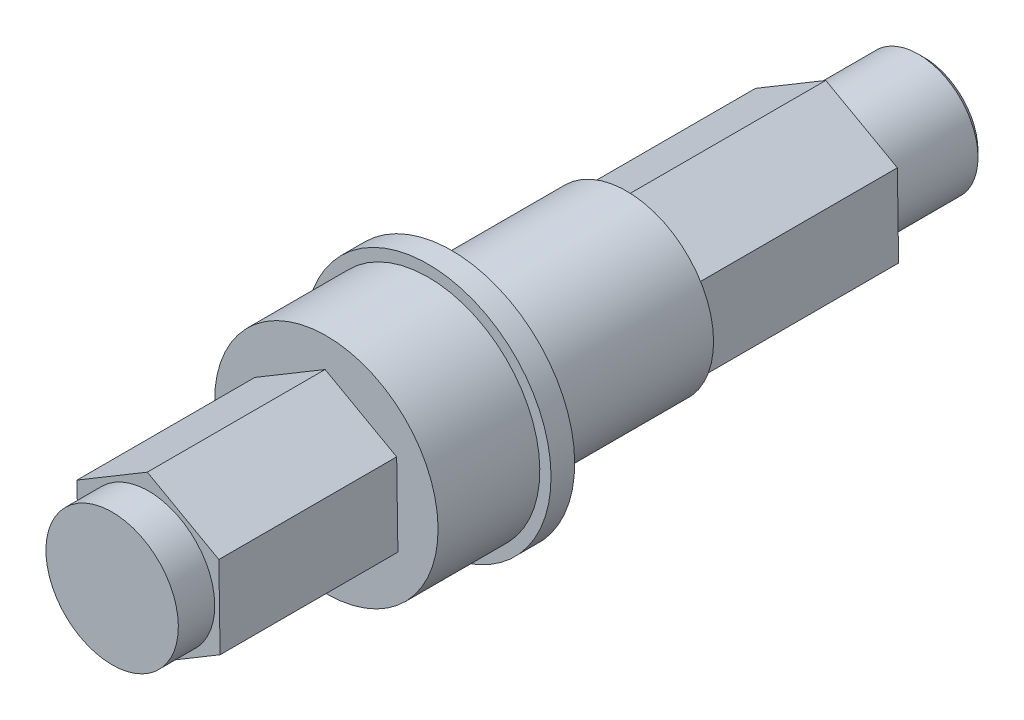
ISO-10303-21;
HEADER;
FILE_DESCRIPTION(('STEP AP214'),'2;1');
FILE_NAME('part.step','',(''),(''),'','','');
FILE_SCHEMA(('AUTOMOTIVE_DESIGN { 1 0 10303 214 1 1 1 1 }'));
ENDSEC;
DATA;
#1=APPLICATION_CONTEXT('core data for automotive mechanical design processes');
#2=APPLICATION_PROTOCOL_DEFINITION('international standard','automotive_design',2000,#1);
#3=PRODUCT_CONTEXT('',#1,'mechanical');
#4=PRODUCT('Part','Part','',(#3));
#5=PRODUCT_RELATED_PRODUCT_CATEGORY('part','',(#4));
#6=PRODUCT_DEFINITION_FORMATION('','',#4);
#7=PRODUCT_DEFINITION_CONTEXT('part definition',#1,'design');
#8=PRODUCT_DEFINITION('design','',#6,#7);
#9=PRODUCT_DEFINITION_SHAPE('','',#8);
#10=(LENGTH_UNIT() NAMED_UNIT(*) SI_UNIT(.MILLI.,.METRE.));
#11=(NAMED_UNIT(*) PLANE_ANGLE_UNIT() SI_UNIT($,.RADIAN.));
#12=(NAMED_UNIT(*) SI_UNIT($,.STERADIAN.) SOLID_ANGLE_UNIT());
#13=UNCERTAINTY_MEASURE_WITH_UNIT(LENGTH_MEASURE(1.E-05),#10,'distance_accuracy_value','');
#14=(GEOMETRIC_REPRESENTATION_CONTEXT(3) GLOBAL_UNCERTAINTY_ASSIGNED_CONTEXT((#13)) GLOBAL_UNIT_ASSIGNED_CONTEXT((#10,
#11,#12)) REPRESENTATION_CONTEXT('',''));
#15=CARTESIAN_POINT('',(0.,0.,0.));
#16=DIRECTION('',(0.,0.,1.));
#17=DIRECTION('',(1.,0.,0.));
#18=AXIS2_PLACEMENT_3D('',#15,#16,#17);
#19=CARTESIAN_POINT('',(19.8104450030768,-19.8104450030789,2.15501016800019));
#20=DIRECTION('',(0.,0.,1.));
#21=DIRECTION('',(0.999886454252792,0.0150691274392579,0.));
#22=AXIS2_PLACEMENT_3D('',#19,#20,#21);
#23=PLANE('',#22);
#24=CARTESIAN_POINT('',(19.8104450030768,-19.8104450030789,2.15501016800019));
#25=DIRECTION('',(0.,0.,1.));
#26=DIRECTION('',(0.999886454252792,0.0150691274392579,0.));
#27=AXIS2_PLACEMENT_3D('',#24,#25,#26);
#28=CIRCLE('',#27,8.255);
#29=CARTESIAN_POINT('',(28.0645076829336,-19.6860493560678,2.15501016800019));
#30=VERTEX_POINT('',#29);
#31=EDGE_CURVE('E267',#30,#30,#28,.T.);
#32=ORIENTED_EDGE('',*,*,#31,.F.);
#33=EDGE_LOOP('',(#32));
#34=FACE_BOUND('',#33,.T.);
#35=CARTESIAN_POINT('',(19.8104450030768,-19.8104450030789,2.15501016800019));
#36=DIRECTION('',(0.,0.,-1.));
#37=DIRECTION('',(0.999886454252792,0.0150691274392579,0.));
#38=AXIS2_PLACEMENT_3D('',#35,#36,#37);
#39=CIRCLE('',#38,5.842);
#40=CARTESIAN_POINT('',(25.6517816688216,-19.7224111605787,2.15501016800019));
#41=VERTEX_POINT('',#40);
#42=EDGE_CURVE('E263',#41,#41,#39,.T.);
#43=ORIENTED_EDGE('',*,*,#42,.F.);
#44=EDGE_LOOP('',(#43));
#45=FACE_BOUND('',#44,.T.);
#46=ADVANCED_FACE('F17',(#34,#45),#23,.F.);
#47=CARTESIAN_POINT('',(19.8104450030768,-19.8104450030789,-9.58150001399979));
#48=DIRECTION('',(0.,0.,1.));
#49=DIRECTION('',(0.999886454252792,0.0150691274392579,0.));
#50=AXIS2_PLACEMENT_3D('',#47,#48,#49);
#51=PLANE('',#50);
#52=CARTESIAN_POINT('',(19.8104450030768,-19.8104450030789,-9.58150001399979));
#53=DIRECTION('',(0.,0.,1.));
#54=DIRECTION('',(0.999886454252792,0.0150691274392579,0.));
#55=AXIS2_PLACEMENT_3D('',#52,#53,#54);
#56=CIRCLE('',#55,5.842);
#57=CARTESIAN_POINT('',(25.6517816688216,-19.7224111605787,-9.58150001399979));
#58=VERTEX_POINT('',#57);
#59=EDGE_CURVE('E259',#58,#58,#56,.T.);
#60=ORIENTED_EDGE('',*,*,#59,.F.);
#61=EDGE_LOOP('',(#60));
#62=FACE_BOUND('',#61,.T.);
#63=DIRECTION('',(-0.0150691274392579,0.999886454252792,0.));
#64=VECTOR('',#63,1.);
#65=CARTESIAN_POINT('',(24.6138387762371,-22.4879967317975,-9.58150001399979));
#66=LINE('',#65,#64);
#67=CARTESIAN_POINT('',(24.6138387762371,-22.4879967317975,-9.58150001399979));
#68=VERTEX_POINT('',#67);
#69=CARTESIAN_POINT('',(24.5309697066742,-16.9893598355013,-9.58150001399979));
#70=VERTEX_POINT('',#69);
#71=EDGE_CURVE('E126',#68,#70,#66,.T.);
#72=ORIENTED_EDGE('',*,*,#71,.T.);
#73=DIRECTION('',(-0.873461634002494,0.486892979951133,0.));
#74=VECTOR('',#73,1.);
#75=CARTESIAN_POINT('',(24.5309697066742,-16.9893598355013,-9.58150001399979));
#76=LINE('',#75,#74);
#77=CARTESIAN_POINT('',(19.7275759335139,-14.3118081067827,-9.58150001399979));
#78=VERTEX_POINT('',#77);
#79=EDGE_CURVE('E137',#70,#78,#76,.T.);
#80=ORIENTED_EDGE('',*,*,#79,.T.);
#81=DIRECTION('',(-0.858392506563236,-0.512993474301658,0.));
#82=VECTOR('',#81,1.);
#83=CARTESIAN_POINT('',(19.7275759335139,-14.3118081067827,-9.58150001399979));
#84=LINE('',#83,#82);
#85=CARTESIAN_POINT('',(15.0070512299164,-17.1328932743602,-9.58150001399979));
#86=VERTEX_POINT('',#85);
#87=EDGE_CURVE('E238',#78,#86,#84,.T.);
#88=ORIENTED_EDGE('',*,*,#87,.T.);
#89=DIRECTION('',(0.015069127439258,-0.999886454252792,0.));
#90=VECTOR('',#89,1.);
#91=CARTESIAN_POINT('',(15.0070512299164,-17.1328932743602,-9.58150001399979));
#92=LINE('',#91,#90);
#93=CARTESIAN_POINT('',(15.0899202994793,-22.6315301706565,-9.58150001399979));
#94=VERTEX_POINT('',#93);
#95=EDGE_CURVE('E244',#86,#94,#92,.T.);
#96=ORIENTED_EDGE('',*,*,#95,.T.);
#97=DIRECTION('',(0.873461634002494,-0.486892979951133,0.));
#98=VECTOR('',#97,1.);
#99=CARTESIAN_POINT('',(15.0899202994793,-22.6315301706565,-9.58150001399979));
#100=LINE('',#99,#98);
#101=CARTESIAN_POINT('',(19.8933140726397,-25.3090818993751,-9.58150001399979));
#102=VERTEX_POINT('',#101);
#103=EDGE_CURVE('E198',#94,#102,#100,.T.);
#104=ORIENTED_EDGE('',*,*,#103,.T.);
#105=DIRECTION('',(0.858392506563236,0.512993474301658,0.));
#106=VECTOR('',#105,1.);
#107=CARTESIAN_POINT('',(19.8933140726397,-25.3090818993751,-9.58150001399979));
#108=LINE('',#107,#106);
#109=EDGE_CURVE('E193',#102,#68,#108,.T.);
#110=ORIENTED_EDGE('',*,*,#109,.T.);
#111=EDGE_LOOP('',(#72,#80,#88,#96,#104,#110));
#112=FACE_BOUND('',#111,.T.);
#113=ADVANCED_FACE('F355',(#62,#112),#51,.F.);
#114=CARTESIAN_POINT('',(24.6138387762371,-22.4879967317975,22.63775));
#115=DIRECTION('',(-0.999886454252792,-0.0150691274392579,0.));
#116=DIRECTION('',(0.0150691274392579,-0.999886454252792,0.));
#117=AXIS2_PLACEMENT_3D('',#114,#115,#116);
#118=PLANE('',#117);
#119=DIRECTION('',(0.0150691274392579,-0.999886454252792,0.));
#120=VECTOR('',#119,1.);
#121=CARTESIAN_POINT('',(24.6138387762371,-22.4879967317975,-23.0435000139998));
#122=LINE('',#121,#120);
#123=CARTESIAN_POINT('',(24.5309697066742,-16.9893598355013,-23.0435000139998));
#124=VERTEX_POINT('',#123);
#125=CARTESIAN_POINT('',(24.6138387762371,-22.4879967317975,-23.0435000139998));
#126=VERTEX_POINT('',#125);
#127=EDGE_CURVE('E210',#124,#126,#122,.T.);
#128=ORIENTED_EDGE('',*,*,#127,.F.);
#129=DIRECTION('',(0.,0.,1.));
#130=VECTOR('',#129,1.);
#131=CARTESIAN_POINT('',(24.5309697066742,-16.9893598355013,22.63775));
#132=LINE('',#131,#130);
#133=EDGE_CURVE('E169',#70,#124,#132,.F.);
#134=ORIENTED_EDGE('',*,*,#133,.F.);
#135=ORIENTED_EDGE('',*,*,#71,.F.);
#136=DIRECTION('',(0.,0.,1.));
#137=VECTOR('',#136,1.);
#138=CARTESIAN_POINT('',(24.6138387762371,-22.4879967317975,22.63775));
#139=LINE('',#138,#137);
#140=EDGE_CURVE('E175',#68,#126,#139,.F.);
#141=ORIENTED_EDGE('',*,*,#140,.T.);
#142=EDGE_LOOP('',(#128,#134,#135,#141));
#143=FACE_BOUND('',#142,.T.);
#144=ADVANCED_FACE('F359',(#143),#118,.F.);
#145=CARTESIAN_POINT('',(24.5309697066742,-16.9893598355013,22.63775));
#146=DIRECTION('',(-0.486892979951133,-0.873461634002494,0.));
#147=DIRECTION('',(0.873461634002494,-0.486892979951133,0.));
#148=AXIS2_PLACEMENT_3D('',#145,#146,#147);
#149=PLANE('',#148);
#150=ORIENTED_EDGE('',*,*,#79,.F.);
#151=ORIENTED_EDGE('',*,*,#133,.T.);
#152=DIRECTION('',(0.873461634002494,-0.486892979951133,0.));
#153=VECTOR('',#152,1.);
#154=CARTESIAN_POINT('',(24.5309697066742,-16.9893598355013,-23.0435000139998));
#155=LINE('',#154,#153);
#156=CARTESIAN_POINT('',(19.7275759335139,-14.3118081067827,-23.0435000139998));
#157=VERTEX_POINT('',#156);
#158=EDGE_CURVE('E223',#157,#124,#155,.T.);
#159=ORIENTED_EDGE('',*,*,#158,.F.);
#160=DIRECTION('',(0.,0.,1.));
#161=VECTOR('',#160,1.);
#162=CARTESIAN_POINT('',(19.7275759335139,-14.3118081067827,22.63775));
#163=LINE('',#162,#161);
#164=EDGE_CURVE('E163',#78,#157,#163,.F.);
#165=ORIENTED_EDGE('',*,*,#164,.F.);
#166=EDGE_LOOP('',(#150,#151,#159,#165));
#167=FACE_BOUND('',#166,.T.);
#168=ADVANCED_FACE('F366',(#167),#149,.F.);
#169=CARTESIAN_POINT('',(19.7275759335139,-14.3118081067827,22.63775));
#170=DIRECTION('',(0.512993474301658,-0.858392506563236,0.));
#171=DIRECTION('',(0.858392506563236,0.512993474301658,0.));
#172=AXIS2_PLACEMENT_3D('',#169,#170,#171);
#173=PLANE('',#172);
#174=ORIENTED_EDGE('',*,*,#87,.F.);
#175=ORIENTED_EDGE('',*,*,#164,.T.);
#176=DIRECTION('',(0.858392506563236,0.512993474301658,0.));
#177=VECTOR('',#176,1.);
#178=CARTESIAN_POINT('',(19.7275759335139,-14.3118081067827,-23.0435000139998));
#179=LINE('',#178,#177);
#180=CARTESIAN_POINT('',(15.0070512299164,-17.1328932743602,-23.0435000139998));
#181=VERTEX_POINT('',#180);
#182=EDGE_CURVE('E207',#181,#157,#179,.T.);
#183=ORIENTED_EDGE('',*,*,#182,.F.);
#184=DIRECTION('',(0.,0.,1.));
#185=VECTOR('',#184,1.);
#186=CARTESIAN_POINT('',(15.0070512299164,-17.1328932743602,22.63775));
#187=LINE('',#186,#185);
#188=EDGE_CURVE('E157',#86,#181,#187,.F.);
#189=ORIENTED_EDGE('',*,*,#188,.F.);
#190=EDGE_LOOP('',(#174,#175,#183,#189));
#191=FACE_BOUND('',#190,.T.);
#192=ADVANCED_FACE('F370',(#191),#173,.F.);
#193=CARTESIAN_POINT('',(15.0070512299164,-17.1328932743602,22.63775));
#194=DIRECTION('',(0.999886454252792,0.015069127439258,0.));
#195=DIRECTION('',(-0.015069127439258,0.999886454252792,0.));
#196=AXIS2_PLACEMENT_3D('',#193,#194,#195);
#197=PLANE('',#196);
#198=ORIENTED_EDGE('',*,*,#95,.F.);
#199=ORIENTED_EDGE('',*,*,#188,.T.);
#200=DIRECTION('',(-0.015069127439258,0.999886454252792,0.));
#201=VECTOR('',#200,1.);
#202=CARTESIAN_POINT('',(15.0070512299164,-17.1328932743602,-23.0435000139998));
#203=LINE('',#202,#201);
#204=CARTESIAN_POINT('',(15.0899202994793,-22.6315301706565,-23.0435000139998));
#205=VERTEX_POINT('',#204);
#206=EDGE_CURVE('E204',#205,#181,#203,.T.);
#207=ORIENTED_EDGE('',*,*,#206,.F.);
#208=DIRECTION('',(0.,0.,1.));
#209=VECTOR('',#208,1.);
#210=CARTESIAN_POINT('',(15.0899202994793,-22.6315301706565,22.63775));
#211=LINE('',#210,#209);
#212=EDGE_CURVE('E153',#94,#205,#211,.F.);
#213=ORIENTED_EDGE('',*,*,#212,.F.);
#214=EDGE_LOOP('',(#198,#199,#207,#213));
#215=FACE_BOUND('',#214,.T.);
#216=ADVANCED_FACE('F375',(#215),#197,.F.);
#217=CARTESIAN_POINT('',(15.0899202994793,-22.6315301706565,22.63775));
#218=DIRECTION('',(0.486892979951133,0.873461634002494,0.));
#219=DIRECTION('',(-0.873461634002494,0.486892979951133,0.));
#220=AXIS2_PLACEMENT_3D('',#217,#218,#219);
#221=PLANE('',#220);
#222=DIRECTION('',(-0.873461634002494,0.486892979951133,0.));
#223=VECTOR('',#222,1.);
#224=CARTESIAN_POINT('',(15.0899202994793,-22.6315301706565,-23.0435000139998));
#225=LINE('',#224,#223);
#226=CARTESIAN_POINT('',(19.8933140726397,-25.3090818993751,-23.0435000139998));
#227=VERTEX_POINT('',#226);
#228=EDGE_CURVE('E200',#227,#205,#225,.T.);
#229=ORIENTED_EDGE('',*,*,#228,.F.);
#230=DIRECTION('',(0.,0.,1.));
#231=VECTOR('',#230,1.);
#232=CARTESIAN_POINT('',(19.8933140726397,-25.3090818993751,22.63775));
#233=LINE('',#232,#231);
#234=EDGE_CURVE('E26',#102,#227,#233,.F.);
#235=ORIENTED_EDGE('',*,*,#234,.F.);
#236=ORIENTED_EDGE('',*,*,#103,.F.);
#237=ORIENTED_EDGE('',*,*,#212,.T.);
#238=EDGE_LOOP('',(#229,#235,#236,#237));
#239=FACE_BOUND('',#238,.T.);
#240=ADVANCED_FACE('F197',(#239),#221,.F.);
#241=CARTESIAN_POINT('',(19.8933140726397,-25.3090818993751,22.63775));
#242=DIRECTION('',(-0.512993474301658,0.858392506563236,0.));
#243=DIRECTION('',(-0.858392506563236,-0.512993474301658,0.));
#244=AXIS2_PLACEMENT_3D('',#241,#242,#243);
#245=PLANE('',#244);
#246=DIRECTION('',(-0.858392506563236,-0.512993474301658,0.));
#247=VECTOR('',#246,1.);
#248=CARTESIAN_POINT('',(19.8933140726397,-25.3090818993751,-23.0435000139998));
#249=LINE('',#248,#247);
#250=EDGE_CURVE('E191',#126,#227,#249,.T.);
#251=ORIENTED_EDGE('',*,*,#250,.F.);
#252=ORIENTED_EDGE('',*,*,#140,.F.);
#253=ORIENTED_EDGE('',*,*,#109,.F.);
#254=ORIENTED_EDGE('',*,*,#234,.T.);
#255=EDGE_LOOP('',(#251,#252,#253,#254));
#256=FACE_BOUND('',#255,.T.);
#257=ADVANCED_FACE('F189',(#256),#245,.F.);
#258=CARTESIAN_POINT('',(19.8104450030768,-19.8104450030789,-23.0435000139998));
#259=DIRECTION('',(0.,0.,-1.));
#260=DIRECTION('',(-0.999886454252792,-0.0150691274392579,0.));
#261=AXIS2_PLACEMENT_3D('',#258,#259,#260);
#262=PLANE('',#261);
#263=ORIENTED_EDGE('',*,*,#158,.T.);
#264=ORIENTED_EDGE('',*,*,#127,.T.);
#265=ORIENTED_EDGE('',*,*,#250,.T.);
#266=ORIENTED_EDGE('',*,*,#228,.T.);
#267=ORIENTED_EDGE('',*,*,#206,.T.);
#268=ORIENTED_EDGE('',*,*,#182,.T.);
#269=EDGE_LOOP('',(#263,#264,#265,#266,#267,#268));
#270=FACE_BOUND('',#269,.T.);
#271=CARTESIAN_POINT('',(19.8104450030768,-19.8104450030789,-23.0435000139998));
#272=DIRECTION('',(0.,0.,-1.));
#273=DIRECTION('',(-0.999886454252792,-0.0150691274392579,0.));
#274=AXIS2_PLACEMENT_3D('',#271,#272,#273);
#275=CIRCLE('',#274,4.);
#276=CARTESIAN_POINT('',(15.8108991860656,-19.8707215128359,-23.0435000139998));
#277=VERTEX_POINT('',#276);
#278=EDGE_CURVE('E266',#277,#277,#275,.T.);
#279=ORIENTED_EDGE('',*,*,#278,.F.);
#280=EDGE_LOOP('',(#279));
#281=FACE_BOUND('',#280,.T.);
#282=ADVANCED_FACE('F381',(#270,#281),#262,.T.);
#283=CARTESIAN_POINT('',(19.8104450030768,-19.8104450030789,-29.55925));
#284=DIRECTION('',(0.,0.,1.));
#285=DIRECTION('',(0.999886454252792,0.0150691274392579,0.));
#286=AXIS2_PLACEMENT_3D('',#283,#284,#285);
#287=PLANE('',#286);
#288=CARTESIAN_POINT('',(19.8104450030768,-19.8104450030789,-29.55925));
#289=DIRECTION('',(0.,0.,-1.));
#290=DIRECTION('',(0.999886454252792,0.0150691274392579,0.));
#291=AXIS2_PLACEMENT_3D('',#288,#289,#290);
#292=CIRCLE('',#291,3.619);
#293=CARTESIAN_POINT('',(23.4290340810177,-19.7559098308762,-29.55925));
#294=VERTEX_POINT('',#293);
#295=EDGE_CURVE('E281',#294,#294,#292,.T.);
#296=ORIENTED_EDGE('',*,*,#295,.T.);
#297=EDGE_LOOP('',(#296));
#298=FACE_BOUND('',#297,.T.);
#299=ADVANCED_FACE('F384',(#298),#287,.F.);
#300=CARTESIAN_POINT('',(19.8104450030768,-19.8104450030789,3.7425101680002));
#301=DIRECTION('',(0.,0.,1.));
#302=DIRECTION('',(0.999886454252792,0.0150691274392579,0.));
#303=AXIS2_PLACEMENT_3D('',#300,#301,#302);
#304=PLANE('',#303);
#305=CARTESIAN_POINT('',(19.8104450030768,-19.8104450030789,3.7425101680002));
#306=DIRECTION('',(0.,0.,1.));
#307=DIRECTION('',(0.999886454252792,0.0150691274392579,0.));
#308=AXIS2_PLACEMENT_3D('',#305,#306,#307);
#309=CIRCLE('',#308,7.499999986);
#310=CARTESIAN_POINT('',(27.3095933959743,-19.6974265474954,3.7425101680002));
#311=VERTEX_POINT('',#310);
#312=EDGE_CURVE('E277',#311,#311,#309,.T.);
#313=ORIENTED_EDGE('',*,*,#312,.F.);
#314=EDGE_LOOP('',(#313));
#315=FACE_BOUND('',#314,.T.);
#316=CARTESIAN_POINT('',(19.8104450030768,-19.8104450030789,3.7425101680002));
#317=DIRECTION('',(0.,0.,1.));
#318=DIRECTION('',(0.999886454252792,0.0150691274392579,0.));
#319=AXIS2_PLACEMENT_3D('',#316,#317,#318);
#320=CIRCLE('',#319,8.255);
#321=CARTESIAN_POINT('',(28.0645076829336,-19.6860493560678,3.7425101680002));
#322=VERTEX_POINT('',#321);
#323=EDGE_CURVE('E271',#322,#322,#320,.T.);
#324=ORIENTED_EDGE('',*,*,#323,.T.);
#325=EDGE_LOOP('',(#324));
#326=FACE_BOUND('',#325,.T.);
#327=ADVANCED_FACE('F395',(#315,#326),#304,.T.);
#328=CARTESIAN_POINT('',(19.8104450030768,-19.8104450030789,22.51075));
#329=DIRECTION('',(0.,0.,1.));
#330=DIRECTION('',(0.999886454252792,0.0150691274392579,0.));
#331=AXIS2_PLACEMENT_3D('',#328,#329,#330);
#332=PLANE('',#331);
#333=CARTESIAN_POINT('',(19.8104450030768,-19.8104450030789,22.51075));
#334=DIRECTION('',(0.,0.,-1.));
#335=DIRECTION('',(0.999886454252792,0.0150691274392579,0.));
#336=AXIS2_PLACEMENT_3D('',#333,#334,#335);
#337=CIRCLE('',#336,4.445);
#338=CARTESIAN_POINT('',(24.2549402922305,-19.7434627316113,22.51075));
#339=VERTEX_POINT('',#338);
#340=EDGE_CURVE('E140',#339,#339,#337,.T.);
#341=ORIENTED_EDGE('',*,*,#340,.T.);
#342=EDGE_LOOP('',(#341));
#343=FACE_BOUND('',#342,.T.);
#344=DIRECTION('',(-0.858392506563236,-0.512993474301658,0.));
#345=VECTOR('',#344,1.);
#346=CARTESIAN_POINT('',(19.7275759335139,-14.3118081067827,22.51075));
#347=LINE('',#346,#345);
#348=CARTESIAN_POINT('',(19.7275759335139,-14.3118081067827,22.51075));
#349=VERTEX_POINT('',#348);
#350=CARTESIAN_POINT('',(15.0070512299164,-17.1328932743602,22.51075));
#351=VERTEX_POINT('',#350);
#352=EDGE_CURVE('E226',#349,#351,#347,.T.);
#353=ORIENTED_EDGE('',*,*,#352,.T.);
#354=DIRECTION('',(0.015069127439258,-0.999886454252792,0.));
#355=VECTOR('',#354,1.);
#356=CARTESIAN_POINT('',(15.0070512299164,-17.1328932743602,22.51075));
#357=LINE('',#356,#355);
#358=CARTESIAN_POINT('',(15.0899202994793,-22.6315301706565,22.51075));
#359=VERTEX_POINT('',#358);
#360=EDGE_CURVE('E312',#351,#359,#357,.T.);
#361=ORIENTED_EDGE('',*,*,#360,.T.);
#362=DIRECTION('',(0.873461634002494,-0.486892979951133,0.));
#363=VECTOR('',#362,1.);
#364=CARTESIAN_POINT('',(15.0899202994793,-22.6315301706565,22.51075));
#365=LINE('',#364,#363);
#366=CARTESIAN_POINT('',(19.8933140726397,-25.3090818993751,22.51075));
#367=VERTEX_POINT('',#366);
#368=EDGE_CURVE('E109',#359,#367,#365,.T.);
#369=ORIENTED_EDGE('',*,*,#368,.T.);
#370=DIRECTION('',(0.858392506563236,0.512993474301658,0.));
#371=VECTOR('',#370,1.);
#372=CARTESIAN_POINT('',(19.8933140726397,-25.3090818993751,22.51075));
#373=LINE('',#372,#371);
#374=CARTESIAN_POINT('',(24.6138387762371,-22.4879967317975,22.51075));
#375=VERTEX_POINT('',#374);
#376=EDGE_CURVE('E106',#367,#375,#373,.T.);
#377=ORIENTED_EDGE('',*,*,#376,.T.);
#378=DIRECTION('',(-0.0150691274392579,0.999886454252792,0.));
#379=VECTOR('',#378,1.);
#380=CARTESIAN_POINT('',(24.6138387762371,-22.4879967317975,22.51075));
#381=LINE('',#380,#379);
#382=CARTESIAN_POINT('',(24.5309697066742,-16.9893598355013,22.51075));
#383=VERTEX_POINT('',#382);
#384=EDGE_CURVE('E40',#375,#383,#381,.T.);
#385=ORIENTED_EDGE('',*,*,#384,.T.);
#386=DIRECTION('',(-0.873461634002494,0.486892979951133,0.));
#387=VECTOR('',#386,1.);
#388=CARTESIAN_POINT('',(24.5309697066742,-16.9893598355013,22.51075));
#389=LINE('',#388,#387);
#390=EDGE_CURVE('E324',#383,#349,#389,.T.);
#391=ORIENTED_EDGE('',*,*,#390,.T.);
#392=EDGE_LOOP('',(#353,#361,#369,#377,#385,#391));
#393=FACE_BOUND('',#392,.T.);
#394=ADVANCED_FACE('F107',(#343,#393),#332,.T.);
#395=CARTESIAN_POINT('',(19.8104450030768,-19.8104450030789,10.5727500000002));
#396=DIRECTION('',(0.,0.,1.));
#397=DIRECTION('',(0.999886454252792,0.0150691274392579,0.));
#398=AXIS2_PLACEMENT_3D('',#395,#396,#397);
#399=PLANE('',#398);
#400=CARTESIAN_POINT('',(19.8104450030768,-19.8104450030789,10.5727500000002));
#401=DIRECTION('',(0.,0.,1.));
#402=DIRECTION('',(0.999886454252792,0.0150691274392579,0.));
#403=AXIS2_PLACEMENT_3D('',#400,#401,#402);
#404=CIRCLE('',#403,7.499999986);
#405=CARTESIAN_POINT('',(27.3095933959743,-19.6974265474954,10.5727500000002));
#406=VERTEX_POINT('',#405);
#407=EDGE_CURVE('E270',#406,#406,#404,.T.);
#408=ORIENTED_EDGE('',*,*,#407,.T.);
#409=EDGE_LOOP('',(#408));
#410=FACE_BOUND('',#409,.T.);
#411=DIRECTION('',(-0.873461634002493,0.486892979951133,0.));
#412=VECTOR('',#411,1.);
#413=CARTESIAN_POINT('',(15.8379767347126,-23.0485186367134,10.5727500000002));
#414=LINE('',#413,#412);
#415=CARTESIAN_POINT('',(19.8933140726397,-25.3090818993751,10.5727500000002));
#416=VERTEX_POINT('',#415);
#417=CARTESIAN_POINT('',(15.0899202994793,-22.6315301706565,10.5727500000002));
#418=VERTEX_POINT('',#417);
#419=EDGE_CURVE('E308',#416,#418,#414,.T.);
#420=ORIENTED_EDGE('',*,*,#419,.T.);
#421=DIRECTION('',(-0.0150691274392579,0.999886454252792,0.));
#422=VECTOR('',#421,1.);
#423=CARTESIAN_POINT('',(15.0199568428426,-17.9892233837652,10.5727500000002));
#424=LINE('',#423,#422);
#425=CARTESIAN_POINT('',(15.0070512299164,-17.1328932743602,10.5727500000002));
#426=VERTEX_POINT('',#425);
#427=EDGE_CURVE('E313',#418,#426,#424,.T.);
#428=ORIENTED_EDGE('',*,*,#427,.T.);
#429=DIRECTION('',(0.858392506563236,0.512993474301658,0.));
#430=VECTOR('',#429,1.);
#431=CARTESIAN_POINT('',(18.9924251112068,-14.7511497501306,10.5727500000002));
#432=LINE('',#431,#430);
#433=CARTESIAN_POINT('',(19.7275759335139,-14.3118081067827,10.5727500000002));
#434=VERTEX_POINT('',#433);
#435=EDGE_CURVE('E317',#426,#434,#432,.T.);
#436=ORIENTED_EDGE('',*,*,#435,.T.);
#437=DIRECTION('',(0.873461634002494,-0.486892979951133,0.));
#438=VECTOR('',#437,1.);
#439=CARTESIAN_POINT('',(23.782913271441,-16.5723713694444,10.5727500000002));
#440=LINE('',#439,#438);
#441=CARTESIAN_POINT('',(24.5309697066742,-16.9893598355013,10.5727500000002));
#442=VERTEX_POINT('',#441);
#443=EDGE_CURVE('E321',#434,#442,#440,.T.);
#444=ORIENTED_EDGE('',*,*,#443,.T.);
#445=DIRECTION('',(0.0150691274392579,-0.999886454252792,0.));
#446=VECTOR('',#445,1.);
#447=CARTESIAN_POINT('',(24.600933163311,-21.6316666223926,10.5727500000002));
#448=LINE('',#447,#446);
#449=CARTESIAN_POINT('',(24.6138387762371,-22.4879967317975,10.5727500000002));
#450=VERTEX_POINT('',#449);
#451=EDGE_CURVE('E32',#442,#450,#448,.T.);
#452=ORIENTED_EDGE('',*,*,#451,.T.);
#453=DIRECTION('',(-0.858392506563236,-0.512993474301658,0.));
#454=VECTOR('',#453,1.);
#455=CARTESIAN_POINT('',(20.6284648949468,-24.8697402560272,10.5727500000002));
#456=LINE('',#455,#454);
#457=EDGE_CURVE('E115',#450,#416,#456,.T.);
#458=ORIENTED_EDGE('',*,*,#457,.T.);
#459=EDGE_LOOP('',(#420,#428,#436,#444,#452,#458));
#460=FACE_BOUND('',#459,.T.);
#461=ADVANCED_FACE('F402',(#410,#460),#399,.T.);
#462=ORIENTED_EDGE('',*,*,#435,.F.);
#463=DIRECTION('',(0.,0.,-1.));
#464=VECTOR('',#463,1.);
#465=CARTESIAN_POINT('',(15.0070512299164,-17.1328932743602,22.63775));
#466=LINE('',#465,#464);
#467=EDGE_CURVE('E133',#426,#351,#466,.F.);
#468=ORIENTED_EDGE('',*,*,#467,.T.);
#469=ORIENTED_EDGE('',*,*,#352,.F.);
#470=DIRECTION('',(0.,0.,-1.));
#471=VECTOR('',#470,1.);
#472=CARTESIAN_POINT('',(19.7275759335139,-14.3118081067827,22.63775));
#473=LINE('',#472,#471);
#474=EDGE_CURVE('E125',#434,#349,#473,.F.);
#475=ORIENTED_EDGE('',*,*,#474,.F.);
#476=EDGE_LOOP('',(#462,#468,#469,#475));
#477=FACE_BOUND('',#476,.T.);
#478=ADVANCED_FACE('F377',(#477),#173,.F.);
#479=ORIENTED_EDGE('',*,*,#360,.F.);
#480=ORIENTED_EDGE('',*,*,#467,.F.);
#481=ORIENTED_EDGE('',*,*,#427,.F.);
#482=DIRECTION('',(0.,0.,-1.));
#483=VECTOR('',#482,1.);
#484=CARTESIAN_POINT('',(15.0899202994793,-22.6315301706565,22.63775));
#485=LINE('',#484,#483);
#486=EDGE_CURVE('E146',#418,#359,#485,.F.);
#487=ORIENTED_EDGE('',*,*,#486,.T.);
#488=EDGE_LOOP('',(#479,#480,#481,#487));
#489=FACE_BOUND('',#488,.T.);
#490=ADVANCED_FACE('F406',(#489),#197,.F.);
#491=ORIENTED_EDGE('',*,*,#368,.F.);
#492=ORIENTED_EDGE('',*,*,#486,.F.);
#493=ORIENTED_EDGE('',*,*,#419,.F.);
#494=DIRECTION('',(0.,0.,-1.));
#495=VECTOR('',#494,1.);
#496=CARTESIAN_POINT('',(19.8933140726397,-25.3090818993751,22.63775));
#497=LINE('',#496,#495);
#498=EDGE_CURVE('E150',#416,#367,#497,.F.);
#499=ORIENTED_EDGE('',*,*,#498,.T.);
#500=EDGE_LOOP('',(#491,#492,#493,#499));
#501=FACE_BOUND('',#500,.T.);
#502=ADVANCED_FACE('F380',(#501),#221,.F.);
#503=ORIENTED_EDGE('',*,*,#376,.F.);
#504=ORIENTED_EDGE('',*,*,#498,.F.);
#505=ORIENTED_EDGE('',*,*,#457,.F.);
#506=DIRECTION('',(0.,0.,-1.));
#507=VECTOR('',#506,1.);
#508=CARTESIAN_POINT('',(24.6138387762371,-22.4879967317975,22.63775));
#509=LINE('',#508,#507);
#510=EDGE_CURVE('E118',#450,#375,#509,.F.);
#511=ORIENTED_EDGE('',*,*,#510,.T.);
#512=EDGE_LOOP('',(#503,#504,#505,#511));
#513=FACE_BOUND('',#512,.T.);
#514=ADVANCED_FACE('F122',(#513),#245,.F.);
#515=ORIENTED_EDGE('',*,*,#451,.F.);
#516=DIRECTION('',(0.,0.,-1.));
#517=VECTOR('',#516,1.);
#518=CARTESIAN_POINT('',(24.5309697066742,-16.9893598355013,22.63775));
#519=LINE('',#518,#517);
#520=EDGE_CURVE('E11',#442,#383,#519,.F.);
#521=ORIENTED_EDGE('',*,*,#520,.T.);
#522=ORIENTED_EDGE('',*,*,#384,.F.);
#523=ORIENTED_EDGE('',*,*,#510,.F.);
#524=EDGE_LOOP('',(#515,#521,#522,#523));
#525=FACE_BOUND('',#524,.T.);
#526=ADVANCED_FACE('F117',(#525),#118,.F.);
#527=ORIENTED_EDGE('',*,*,#443,.F.);
#528=ORIENTED_EDGE('',*,*,#474,.T.);
#529=ORIENTED_EDGE('',*,*,#390,.F.);
#530=ORIENTED_EDGE('',*,*,#520,.F.);
#531=EDGE_LOOP('',(#527,#528,#529,#530));
#532=FACE_BOUND('',#531,.T.);
#533=ADVANCED_FACE('F372',(#532),#149,.F.);
#534=CARTESIAN_POINT('',(19.8104450030768,-19.8104450030789,32.2939533959987));
#535=DIRECTION('',(0.,0.,-1.));
#536=DIRECTION('',(-0.999886454252792,-0.0150691274392579,0.));
#537=AXIS2_PLACEMENT_3D('',#534,#535,#536);
#538=CYLINDRICAL_SURFACE('',#537,7.499999986);
#539=ORIENTED_EDGE('',*,*,#312,.T.);
#540=EDGE_LOOP('',(#539));
#541=FACE_BOUND('',#540,.T.);
#542=ORIENTED_EDGE('',*,*,#407,.F.);
#543=EDGE_LOOP('',(#542));
#544=FACE_BOUND('',#543,.T.);
#545=ADVANCED_FACE('F412',(#541,#544),#538,.T.);
#546=CARTESIAN_POINT('',(19.8104450030768,-19.8104450030789,3.7425101680002));
#547=DIRECTION('',(0.,0.,-1.));
#548=DIRECTION('',(-0.999886454252792,-0.0150691274392579,0.));
#549=AXIS2_PLACEMENT_3D('',#546,#547,#548);
#550=CYLINDRICAL_SURFACE('',#549,8.255);
#551=ORIENTED_EDGE('',*,*,#31,.T.);
#552=EDGE_LOOP('',(#551));
#553=FACE_BOUND('',#552,.T.);
#554=ORIENTED_EDGE('',*,*,#323,.F.);
#555=EDGE_LOOP('',(#554));
#556=FACE_BOUND('',#555,.T.);
#557=ADVANCED_FACE('F391',(#553,#556),#550,.T.);
#558=CARTESIAN_POINT('',(19.8104450030768,-19.8104450030789,-29.55925));
#559=DIRECTION('',(0.,0.,1.));
#560=DIRECTION('',(0.999886454252792,0.0150691274392579,0.));
#561=AXIS2_PLACEMENT_3D('',#558,#559,#560);
#562=CONICAL_SURFACE('',#561,3.619,0.785398163397437);
#563=CARTESIAN_POINT('',(19.8104450030768,-19.8104450030789,-29.17825));
#564=DIRECTION('',(0.,0.,1.));
#565=DIRECTION('',(0.999886454252792,0.0150691274392579,0.));
#566=AXIS2_PLACEMENT_3D('',#563,#564,#565);
#567=CIRCLE('',#566,4.);
#568=CARTESIAN_POINT('',(23.809990820088,-19.7501684933218,-29.17825));
#569=VERTEX_POINT('',#568);
#570=EDGE_CURVE('E288',#569,#569,#567,.T.);
#571=ORIENTED_EDGE('',*,*,#570,.F.);
#572=EDGE_LOOP('',(#571));
#573=FACE_BOUND('',#572,.T.);
#574=ORIENTED_EDGE('',*,*,#295,.F.);
#575=EDGE_LOOP('',(#574));
#576=FACE_BOUND('',#575,.T.);
#577=ADVANCED_FACE('F388',(#573,#576),#562,.T.);
#578=CARTESIAN_POINT('',(19.8104450030768,-19.8104450030789,-23.0435000139998));
#579=DIRECTION('',(0.,0.,-1.));
#580=DIRECTION('',(-0.999886454252792,-0.0150691274392579,0.));
#581=AXIS2_PLACEMENT_3D('',#578,#579,#580);
#582=CYLINDRICAL_SURFACE('',#581,4.);
#583=ORIENTED_EDGE('',*,*,#570,.T.);
#584=EDGE_LOOP('',(#583));
#585=FACE_BOUND('',#584,.T.);
#586=ORIENTED_EDGE('',*,*,#278,.T.);
#587=EDGE_LOOP('',(#586));
#588=FACE_BOUND('',#587,.T.);
#589=ADVANCED_FACE('F385',(#585,#588),#582,.T.);
#590=CARTESIAN_POINT('',(19.8104450030768,-19.8104450030789,-9.58150001399979));
#591=DIRECTION('',(0.,0.,1.));
#592=DIRECTION('',(0.999886454252792,0.0150691274392579,0.));
#593=AXIS2_PLACEMENT_3D('',#590,#591,#592);
#594=CYLINDRICAL_SURFACE('',#593,5.842);
#595=ORIENTED_EDGE('',*,*,#42,.T.);
#596=EDGE_LOOP('',(#595));
#597=FACE_BOUND('',#596,.T.);
#598=ORIENTED_EDGE('',*,*,#59,.T.);
#599=EDGE_LOOP('',(#598));
#600=FACE_BOUND('',#599,.T.);
#601=ADVANCED_FACE('F352',(#597,#600),#594,.T.);
#602=CARTESIAN_POINT('',(19.8104450030768,-19.8104450030789,24.9555));
#603=DIRECTION('',(0.,0.,1.));
#604=DIRECTION('',(0.999886454252792,0.0150691274392579,0.));
#605=AXIS2_PLACEMENT_3D('',#602,#603,#604);
#606=PLANE('',#605);
#607=CARTESIAN_POINT('',(19.8104450030768,-19.8104450030789,24.9555));
#608=DIRECTION('',(0.,0.,1.));
#609=DIRECTION('',(0.999886454252792,0.0150691274392579,0.));
#610=AXIS2_PLACEMENT_3D('',#607,#608,#609);
#611=CIRCLE('',#610,4.445);
#612=CARTESIAN_POINT('',(24.2549402922305,-19.7434627316113,24.9555));
#613=VERTEX_POINT('',#612);
#614=EDGE_CURVE('E294',#613,#613,#611,.T.);
#615=ORIENTED_EDGE('',*,*,#614,.T.);
#616=EDGE_LOOP('',(#615));
#617=FACE_BOUND('',#616,.T.);
#618=ADVANCED_FACE('F347',(#617),#606,.T.);
#619=CARTESIAN_POINT('',(19.8104450030768,-19.8104450030789,25.4635));
#620=DIRECTION('',(0.,0.,-1.));
#621=DIRECTION('',(-0.999886454252792,-0.0150691274392579,0.));
#622=AXIS2_PLACEMENT_3D('',#619,#620,#621);
#623=CYLINDRICAL_SURFACE('',#622,4.445);
#624=ORIENTED_EDGE('',*,*,#614,.F.);
#625=EDGE_LOOP('',(#624));
#626=FACE_BOUND('',#625,.T.);
#627=ORIENTED_EDGE('',*,*,#340,.F.);
#628=EDGE_LOOP('',(#627));
#629=FACE_BOUND('',#628,.T.);
#630=ADVANCED_FACE('F19',(#626,#629),#623,.T.);
#631=CLOSED_SHELL('',(#46,#113,#144,#168,#192,#216,#240,#257,#282,#299,#327,#394,#461,#478,#490,
#502,#514,#526,#533,#545,#557,#577,#589,#601,#618,#630));
#632=MANIFOLD_SOLID_BREP('B1',#631);
#633=ADVANCED_BREP_SHAPE_REPRESENTATION('',(#18,#632),#14);
#634=SHAPE_DEFINITION_REPRESENTATION(#9,#633);
ENDSEC;
END-ISO-10303-21;
